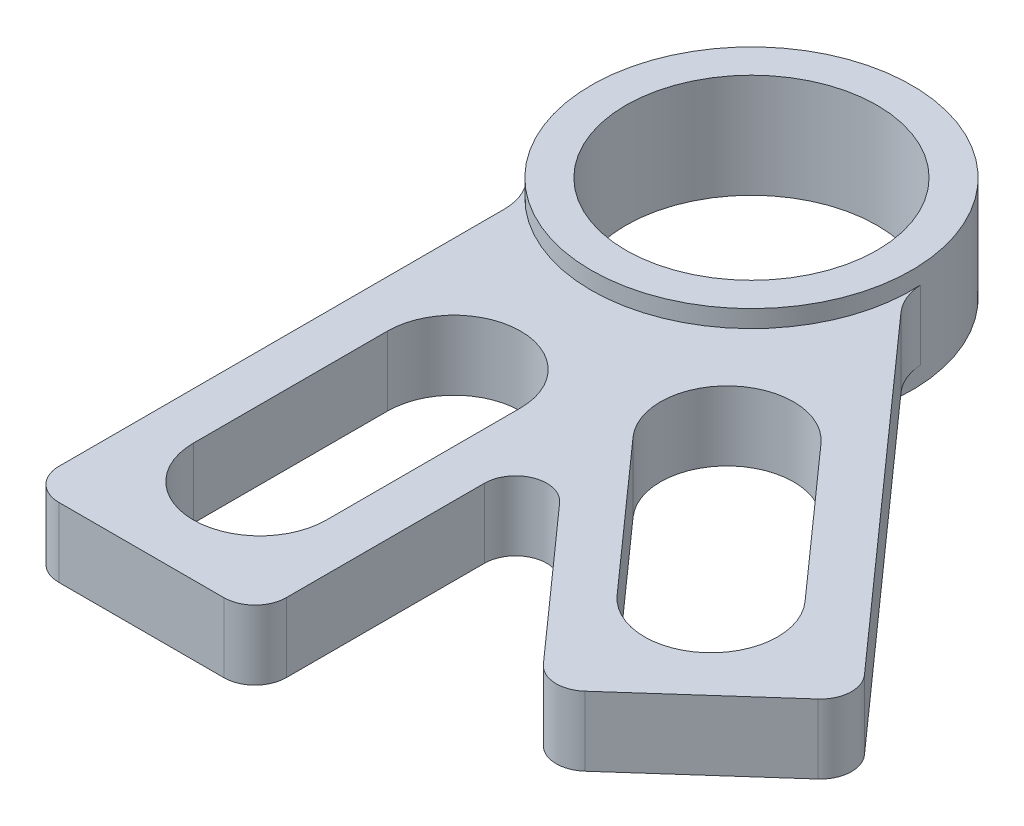
ISO-10303-21;
HEADER;
FILE_DESCRIPTION(('STEP AP214'),'2;1');
FILE_NAME('part.step','',(''),(''),'','','');
FILE_SCHEMA(('AUTOMOTIVE_DESIGN { 1 0 10303 214 1 1 1 1 }'));
ENDSEC;
DATA;
#1=APPLICATION_CONTEXT('core data for automotive mechanical design processes');
#2=APPLICATION_PROTOCOL_DEFINITION('international standard','automotive_design',2000,#1);
#3=PRODUCT_CONTEXT('',#1,'mechanical');
#4=PRODUCT('Part','Part','',(#3));
#5=PRODUCT_RELATED_PRODUCT_CATEGORY('part','',(#4));
#6=PRODUCT_DEFINITION_FORMATION('','',#4);
#7=PRODUCT_DEFINITION_CONTEXT('part definition',#1,'design');
#8=PRODUCT_DEFINITION('design','',#6,#7);
#9=PRODUCT_DEFINITION_SHAPE('','',#8);
#10=(LENGTH_UNIT() NAMED_UNIT(*) SI_UNIT(.MILLI.,.METRE.));
#11=(NAMED_UNIT(*) PLANE_ANGLE_UNIT() SI_UNIT($,.RADIAN.));
#12=(NAMED_UNIT(*) SI_UNIT($,.STERADIAN.) SOLID_ANGLE_UNIT());
#13=UNCERTAINTY_MEASURE_WITH_UNIT(LENGTH_MEASURE(1.E-05),#10,'distance_accuracy_value','');
#14=(GEOMETRIC_REPRESENTATION_CONTEXT(3) GLOBAL_UNCERTAINTY_ASSIGNED_CONTEXT((#13)) GLOBAL_UNIT_ASSIGNED_CONTEXT((#10,
#11,#12)) REPRESENTATION_CONTEXT('',''));
#15=CARTESIAN_POINT('',(0.,0.,0.));
#16=DIRECTION('',(0.,0.,1.));
#17=DIRECTION('',(1.,0.,0.));
#18=AXIS2_PLACEMENT_3D('',#15,#16,#17);
#19=CARTESIAN_POINT('',(0.,4.7625,0.));
#20=DIRECTION('',(0.,-1.,0.));
#21=DIRECTION('',(0.,0.,-1.));
#22=AXIS2_PLACEMENT_3D('',#19,#20,#21);
#23=CYLINDRICAL_SURFACE('',#22,11.5062);
#24=CARTESIAN_POINT('',(0.,4.7625,0.));
#25=DIRECTION('',(0.,1.,0.));
#26=DIRECTION('',(0.,0.,1.));
#27=AXIS2_PLACEMENT_3D('',#24,#25,#26);
#28=CIRCLE('',#27,11.5062);
#29=CARTESIAN_POINT('',(0.,4.7625,-11.5062));
#30=VERTEX_POINT('',#29);
#31=EDGE_CURVE('E301',#30,#30,#28,.T.);
#32=CARTESIAN_POINT('',(0.,-4.7625,0.));
#33=DIRECTION('',(0.,1.,0.));
#34=DIRECTION('',(0.,0.,1.));
#35=AXIS2_PLACEMENT_3D('',#32,#33,#34);
#36=CIRCLE('',#35,11.5062);
#37=CARTESIAN_POINT('',(0.,-4.7625,-11.5062));
#38=VERTEX_POINT('',#37);
#39=EDGE_CURVE('E296',#38,#38,#36,.T.);
#40=CARTESIAN_POINT('',(0.,4.7625,-11.5062));
#41=CARTESIAN_POINT('',(0.,4.66328125,-11.5062));
#42=CARTESIAN_POINT('',(0.,4.5640625,-11.5062));
#43=CARTESIAN_POINT('',(0.,4.365625,-11.5062));
#44=CARTESIAN_POINT('',(0.,4.26640625,-11.5062));
#45=CARTESIAN_POINT('',(0.,4.06796875,-11.5062));
#46=CARTESIAN_POINT('',(0.,3.96875,-11.5062));
#47=CARTESIAN_POINT('',(0.,3.7703125,-11.5062));
#48=CARTESIAN_POINT('',(0.,3.67109375,-11.5062));
#49=CARTESIAN_POINT('',(0.,3.47265625,-11.5062));
#50=CARTESIAN_POINT('',(0.,3.3734375,-11.5062));
#51=CARTESIAN_POINT('',(0.,3.175,-11.5062));
#52=CARTESIAN_POINT('',(0.,3.07578125,-11.5062));
#53=CARTESIAN_POINT('',(0.,2.87734375,-11.5062));
#54=CARTESIAN_POINT('',(0.,2.778125,-11.5062));
#55=CARTESIAN_POINT('',(0.,2.5796875,-11.5062));
#56=CARTESIAN_POINT('',(0.,2.48046875,-11.5062));
#57=CARTESIAN_POINT('',(0.,2.28203125,-11.5062));
#58=CARTESIAN_POINT('',(0.,2.1828125,-11.5062));
#59=CARTESIAN_POINT('',(0.,1.984375,-11.5062));
#60=CARTESIAN_POINT('',(0.,1.88515625,-11.5062));
#61=CARTESIAN_POINT('',(0.,1.68671875,-11.5062));
#62=CARTESIAN_POINT('',(0.,1.5875,-11.5062));
#63=CARTESIAN_POINT('',(0.,1.3890625,-11.5062));
#64=CARTESIAN_POINT('',(0.,1.28984375,-11.5062));
#65=CARTESIAN_POINT('',(0.,1.09140625,-11.5062));
#66=CARTESIAN_POINT('',(0.,0.992187499999999,-11.5062));
#67=CARTESIAN_POINT('',(0.,0.79375,-11.5062));
#68=CARTESIAN_POINT('',(0.,0.69453125,-11.5062));
#69=CARTESIAN_POINT('',(0.,0.49609375,-11.5062));
#70=CARTESIAN_POINT('',(0.,0.396875,-11.5062));
#71=CARTESIAN_POINT('',(0.,0.1984375,-11.5062));
#72=CARTESIAN_POINT('',(0.,0.0992187500000001,-11.5062));
#73=CARTESIAN_POINT('',(0.,-0.0992187500000001,-11.5062));
#74=CARTESIAN_POINT('',(0.,-0.1984375,-11.5062));
#75=CARTESIAN_POINT('',(0.,-0.396875,-11.5062));
#76=CARTESIAN_POINT('',(0.,-0.49609375,-11.5062));
#77=CARTESIAN_POINT('',(0.,-0.69453125,-11.5062));
#78=CARTESIAN_POINT('',(0.,-0.793750000000001,-11.5062));
#79=CARTESIAN_POINT('',(0.,-0.992187500000001,-11.5062));
#80=CARTESIAN_POINT('',(0.,-1.09140625,-11.5062));
#81=CARTESIAN_POINT('',(0.,-1.28984375,-11.5062));
#82=CARTESIAN_POINT('',(0.,-1.3890625,-11.5062));
#83=CARTESIAN_POINT('',(0.,-1.5875,-11.5062));
#84=CARTESIAN_POINT('',(0.,-1.68671875,-11.5062));
#85=CARTESIAN_POINT('',(0.,-1.88515625,-11.5062));
#86=CARTESIAN_POINT('',(0.,-1.984375,-11.5062));
#87=CARTESIAN_POINT('',(0.,-2.1828125,-11.5062));
#88=CARTESIAN_POINT('',(0.,-2.28203125,-11.5062));
#89=CARTESIAN_POINT('',(0.,-2.48046875,-11.5062));
#90=CARTESIAN_POINT('',(0.,-2.5796875,-11.5062));
#91=CARTESIAN_POINT('',(0.,-2.778125,-11.5062));
#92=CARTESIAN_POINT('',(0.,-2.87734375,-11.5062));
#93=CARTESIAN_POINT('',(0.,-3.07578125,-11.5062));
#94=CARTESIAN_POINT('',(0.,-3.175,-11.5062));
#95=CARTESIAN_POINT('',(0.,-3.3734375,-11.5062));
#96=CARTESIAN_POINT('',(0.,-3.47265625,-11.5062));
#97=CARTESIAN_POINT('',(0.,-3.67109375,-11.5062));
#98=CARTESIAN_POINT('',(0.,-3.7703125,-11.5062));
#99=CARTESIAN_POINT('',(0.,-3.96875,-11.5062));
#100=CARTESIAN_POINT('',(0.,-4.06796875,-11.5062));
#101=CARTESIAN_POINT('',(0.,-4.26640625,-11.5062));
#102=CARTESIAN_POINT('',(0.,-4.365625,-11.5062));
#103=CARTESIAN_POINT('',(0.,-4.5640625,-11.5062));
#104=CARTESIAN_POINT('',(0.,-4.66328125,-11.5062));
#105=CARTESIAN_POINT('',(0.,-4.7625,-11.5062));
#106=B_SPLINE_CURVE_WITH_KNOTS('',3,(#40,#41,#42,#43,#44,#45,#46,#47,#48,#49,#50,#51,#52,#53,
#54,#55,#56,#57,#58,#59,#60,#61,#62,#63,#64,#65,#66,#67,#68,#69,#70,#71,#72,#73,#74,#75,#76,#77,
#78,#79,#80,#81,#82,#83,#84,#85,#86,#87,#88,#89,#90,#91,#92,#93,#94,#95,#96,#97,#98,#99,#100,
#101,#102,#103,#104,#105),.UNSPECIFIED.,.F.,.F.,(4,2,2,2,2,2,2,2,2,2,2,2,2,2,2,2,2,2,2,2,2,2,2,
2,2,2,2,2,2,2,2,2,4),(0.,0.29765625,0.5953125,0.892968750000001,1.190625,1.48828125,1.7859375,
2.08359375,2.38125,2.67890625,2.9765625,3.27421875,3.571875,3.86953125,4.1671875,4.46484375,
4.7625,5.06015625,5.3578125,5.65546875,5.953125,6.25078125,6.5484375,6.84609375,7.14375,
7.44140625,7.7390625,8.03671875,8.334375,8.63203125,8.9296875,9.22734375,9.525),.UNSPECIFIED.);
#107=EDGE_CURVE('BSEAM43',#30,#38,#106,.T.);
#108=ORIENTED_EDGE('',*,*,#31,.T.);
#109=ORIENTED_EDGE('',*,*,#39,.F.);
#110=ORIENTED_EDGE('',*,*,#107,.T.);
#111=ORIENTED_EDGE('',*,*,#107,.F.);
#112=EDGE_LOOP('',(#108,#110,#109,#111));
#113=FACE_BOUND('',#112,.T.);
#114=ADVANCED_FACE('F43',(#113),#23,.F.);
#115=CARTESIAN_POINT('',(0.,4.7625,0.));
#116=DIRECTION('',(0.,-1.,0.));
#117=DIRECTION('',(0.,0.,-1.));
#118=AXIS2_PLACEMENT_3D('',#115,#116,#117);
#119=CYLINDRICAL_SURFACE('',#118,14.6812);
#120=DIRECTION('',(0.,-1.,0.));
#121=VECTOR('',#120,1.);
#122=CARTESIAN_POINT('',(14.6568049635446,4.7625,-0.845991548784944));
#123=LINE('',#122,#121);
#124=CARTESIAN_POINT('',(14.6568049635446,3.175,-0.845991548784944));
#125=VERTEX_POINT('',#124);
#126=CARTESIAN_POINT('',(14.6568049635446,-3.175,-0.845991548784944));
#127=VERTEX_POINT('',#126);
#128=EDGE_CURVE('E315',#125,#127,#123,.T.);
#129=ORIENTED_EDGE('',*,*,#128,.T.);
#130=CARTESIAN_POINT('',(0.,-3.175,0.));
#131=DIRECTION('',(0.,1.,0.));
#132=DIRECTION('',(0.,0.,1.));
#133=AXIS2_PLACEMENT_3D('',#130,#131,#132);
#134=CIRCLE('',#133,14.6812);
#135=CARTESIAN_POINT('',(-11.5109665809769,-3.175,9.11236971438461));
#136=VERTEX_POINT('',#135);
#137=EDGE_CURVE('E272',#136,#127,#134,.T.);
#138=ORIENTED_EDGE('',*,*,#137,.F.);
#139=DIRECTION('',(0.,-1.,0.));
#140=VECTOR('',#139,1.);
#141=CARTESIAN_POINT('',(-11.5109665809769,4.7625,9.11236971438461));
#142=LINE('',#141,#140);
#143=CARTESIAN_POINT('',(-11.5109665809769,3.175,9.11236971438461));
#144=VERTEX_POINT('',#143);
#145=EDGE_CURVE('E308',#136,#144,#142,.F.);
#146=ORIENTED_EDGE('',*,*,#145,.T.);
#147=CARTESIAN_POINT('',(0.,3.175,0.));
#148=DIRECTION('',(0.,1.,0.));
#149=DIRECTION('',(0.,0.,1.));
#150=AXIS2_PLACEMENT_3D('',#147,#148,#149);
#151=CIRCLE('',#150,14.6812);
#152=EDGE_CURVE('E234',#144,#125,#151,.T.);
#153=ORIENTED_EDGE('',*,*,#152,.T.);
#154=EDGE_LOOP('',(#129,#138,#146,#153));
#155=FACE_BOUND('',#154,.T.);
#156=CARTESIAN_POINT('',(0.,4.7625,0.));
#157=DIRECTION('',(0.,1.,0.));
#158=DIRECTION('',(0.,0.,1.));
#159=AXIS2_PLACEMENT_3D('',#156,#157,#158);
#160=CIRCLE('',#159,14.6812);
#161=CARTESIAN_POINT('',(0.,4.7625,14.6812));
#162=VERTEX_POINT('',#161);
#163=EDGE_CURVE('E304',#162,#162,#160,.T.);
#164=ORIENTED_EDGE('',*,*,#163,.F.);
#165=EDGE_LOOP('',(#164));
#166=FACE_BOUND('',#165,.T.);
#167=CARTESIAN_POINT('',(0.,-4.7625,0.));
#168=DIRECTION('',(0.,1.,0.));
#169=DIRECTION('',(0.,0.,1.));
#170=AXIS2_PLACEMENT_3D('',#167,#168,#169);
#171=CIRCLE('',#170,14.6812);
#172=CARTESIAN_POINT('',(0.,-4.7625,14.6812));
#173=VERTEX_POINT('',#172);
#174=EDGE_CURVE('E305',#173,#173,#171,.T.);
#175=ORIENTED_EDGE('',*,*,#174,.T.);
#176=EDGE_LOOP('',(#175));
#177=FACE_BOUND('',#176,.T.);
#178=ADVANCED_FACE('F411',(#155,#166,#177),#119,.T.);
#179=CARTESIAN_POINT('',(0.,4.7625,0.));
#180=DIRECTION('',(0.,1.,0.));
#181=DIRECTION('',(0.,0.,1.));
#182=AXIS2_PLACEMENT_3D('',#179,#180,#181);
#183=PLANE('',#182);
#184=ORIENTED_EDGE('',*,*,#31,.F.);
#185=EDGE_LOOP('',(#184));
#186=FACE_BOUND('',#185,.T.);
#187=ORIENTED_EDGE('',*,*,#163,.T.);
#188=EDGE_LOOP('',(#187));
#189=FACE_BOUND('',#188,.T.);
#190=ADVANCED_FACE('F447',(#186,#189),#183,.T.);
#191=CARTESIAN_POINT('',(0.,-4.7625,0.));
#192=DIRECTION('',(0.,1.,0.));
#193=DIRECTION('',(0.,0.,1.));
#194=AXIS2_PLACEMENT_3D('',#191,#192,#193);
#195=PLANE('',#194);
#196=ORIENTED_EDGE('',*,*,#39,.T.);
#197=EDGE_LOOP('',(#196));
#198=FACE_BOUND('',#197,.T.);
#199=ORIENTED_EDGE('',*,*,#174,.F.);
#200=EDGE_LOOP('',(#199));
#201=FACE_BOUND('',#200,.T.);
#202=ADVANCED_FACE('F621',(#198,#201),#195,.F.);
#203=CARTESIAN_POINT('',(-10.414,3.175,0.));
#204=DIRECTION('',(-1.,0.,0.));
#205=DIRECTION('',(0.,0.,1.));
#206=AXIS2_PLACEMENT_3D('',#203,#204,#205);
#207=PLANE('',#206);
#208=DIRECTION('',(0.,0.,-1.));
#209=VECTOR('',#208,1.);
#210=CARTESIAN_POINT('',(-10.414,-3.175,0.));
#211=LINE('',#210,#209);
#212=CARTESIAN_POINT('',(-10.414,-3.175,53.0225));
#213=VERTEX_POINT('',#212);
#214=CARTESIAN_POINT('',(-10.414,-3.175,12.265438819708));
#215=VERTEX_POINT('',#214);
#216=EDGE_CURVE('E274',#213,#215,#211,.T.);
#217=ORIENTED_EDGE('',*,*,#216,.F.);
#218=DIRECTION('',(0.,-1.,0.));
#219=VECTOR('',#218,1.);
#220=CARTESIAN_POINT('',(-10.414,3.175,53.0225));
#221=LINE('',#220,#219);
#222=CARTESIAN_POINT('',(-10.414,3.175,53.0225));
#223=VERTEX_POINT('',#222);
#224=EDGE_CURVE('E374',#213,#223,#221,.F.);
#225=ORIENTED_EDGE('',*,*,#224,.T.);
#226=DIRECTION('',(0.,0.,-1.));
#227=VECTOR('',#226,1.);
#228=CARTESIAN_POINT('',(-10.414,3.175,0.));
#229=LINE('',#228,#227);
#230=CARTESIAN_POINT('',(-10.414,3.175,12.265438819708));
#231=VERTEX_POINT('',#230);
#232=EDGE_CURVE('E236',#223,#231,#229,.T.);
#233=ORIENTED_EDGE('',*,*,#232,.T.);
#234=DIRECTION('',(0.,-1.,0.));
#235=VECTOR('',#234,1.);
#236=CARTESIAN_POINT('',(-10.414,3.175,12.265438819708));
#237=LINE('',#236,#235);
#238=EDGE_CURVE('E321',#231,#215,#237,.T.);
#239=ORIENTED_EDGE('',*,*,#238,.T.);
#240=EDGE_LOOP('',(#217,#225,#233,#239));
#241=FACE_BOUND('',#240,.T.);
#242=ADVANCED_FACE('F613',(#241),#207,.T.);
#243=CARTESIAN_POINT('',(0.,3.175,55.88));
#244=DIRECTION('',(0.,0.,-1.));
#245=DIRECTION('',(-1.,0.,0.));
#246=AXIS2_PLACEMENT_3D('',#243,#244,#245);
#247=PLANE('',#246);
#248=DIRECTION('',(1.,0.,0.));
#249=VECTOR('',#248,1.);
#250=CARTESIAN_POINT('',(0.,-3.175,55.88));
#251=LINE('',#250,#249);
#252=CARTESIAN_POINT('',(-7.55649999999999,-3.175,55.88));
#253=VERTEX_POINT('',#252);
#254=CARTESIAN_POINT('',(7.55650000000001,-3.175,55.88));
#255=VERTEX_POINT('',#254);
#256=EDGE_CURVE('E276',#253,#255,#251,.T.);
#257=ORIENTED_EDGE('',*,*,#256,.T.);
#258=DIRECTION('',(0.,-1.,0.));
#259=VECTOR('',#258,1.);
#260=CARTESIAN_POINT('',(7.55650000000001,3.175,55.88));
#261=LINE('',#260,#259);
#262=CARTESIAN_POINT('',(7.55650000000001,3.175,55.88));
#263=VERTEX_POINT('',#262);
#264=EDGE_CURVE('E372',#255,#263,#261,.F.);
#265=ORIENTED_EDGE('',*,*,#264,.T.);
#266=DIRECTION('',(1.,0.,0.));
#267=VECTOR('',#266,1.);
#268=CARTESIAN_POINT('',(0.,3.175,55.88));
#269=LINE('',#268,#267);
#270=CARTESIAN_POINT('',(-7.55649999999999,3.175,55.88));
#271=VERTEX_POINT('',#270);
#272=EDGE_CURVE('E238',#271,#263,#269,.T.);
#273=ORIENTED_EDGE('',*,*,#272,.F.);
#274=DIRECTION('',(0.,-1.,0.));
#275=VECTOR('',#274,1.);
#276=CARTESIAN_POINT('',(-7.55649999999999,-3.175,55.88));
#277=LINE('',#276,#275);
#278=EDGE_CURVE('E369',#271,#253,#277,.T.);
#279=ORIENTED_EDGE('',*,*,#278,.T.);
#280=EDGE_LOOP('',(#257,#265,#273,#279));
#281=FACE_BOUND('',#280,.T.);
#282=ADVANCED_FACE('F428',(#281),#247,.F.);
#283=CARTESIAN_POINT('',(10.414,3.175,0.));
#284=DIRECTION('',(-1.,0.,0.));
#285=DIRECTION('',(0.,0.,1.));
#286=AXIS2_PLACEMENT_3D('',#283,#284,#285);
#287=PLANE('',#286);
#288=DIRECTION('',(0.,0.,-1.));
#289=VECTOR('',#288,1.);
#290=CARTESIAN_POINT('',(10.414,-3.175,0.));
#291=LINE('',#290,#289);
#292=CARTESIAN_POINT('',(10.414,-3.175,53.0225));
#293=VERTEX_POINT('',#292);
#294=CARTESIAN_POINT('',(10.414,-3.175,34.8737679699906));
#295=VERTEX_POINT('',#294);
#296=EDGE_CURVE('E279',#293,#295,#291,.T.);
#297=ORIENTED_EDGE('',*,*,#296,.T.);
#298=DIRECTION('',(0.,-1.,0.));
#299=VECTOR('',#298,1.);
#300=CARTESIAN_POINT('',(10.414,3.175,34.8737679699906));
#301=LINE('',#300,#299);
#302=CARTESIAN_POINT('',(10.414,3.175,34.8737679699906));
#303=VERTEX_POINT('',#302);
#304=EDGE_CURVE('E367',#295,#303,#301,.F.);
#305=ORIENTED_EDGE('',*,*,#304,.T.);
#306=DIRECTION('',(0.,0.,-1.));
#307=VECTOR('',#306,1.);
#308=CARTESIAN_POINT('',(10.414,3.175,0.));
#309=LINE('',#308,#307);
#310=CARTESIAN_POINT('',(10.414,3.175,53.0225));
#311=VERTEX_POINT('',#310);
#312=EDGE_CURVE('E241',#311,#303,#309,.T.);
#313=ORIENTED_EDGE('',*,*,#312,.F.);
#314=DIRECTION('',(0.,-1.,0.));
#315=VECTOR('',#314,1.);
#316=CARTESIAN_POINT('',(10.414,3.175,53.0225));
#317=LINE('',#316,#315);
#318=EDGE_CURVE('E364',#311,#293,#317,.T.);
#319=ORIENTED_EDGE('',*,*,#318,.T.);
#320=EDGE_LOOP('',(#297,#305,#313,#319));
#321=FACE_BOUND('',#320,.T.);
#322=ADVANCED_FACE('F383',(#321),#287,.F.);
#323=CARTESIAN_POINT('',(-7.77918031554812,3.175,6.92356480566002));
#324=DIRECTION('',(-0.746992540383008,0.,0.664832418442528));
#325=DIRECTION('',(0.664832418442528,0.,0.746992540383008));
#326=AXIS2_PLACEMENT_3D('',#323,#324,#325);
#327=PLANE('',#326);
#328=DIRECTION('',(-0.664832418442528,0.,-0.746992540383008));
#329=VECTOR('',#328,1.);
#330=CARTESIAN_POINT('',(-7.77918031554812,-3.175,6.92356480566002));
#331=LINE('',#330,#329);
#332=CARTESIAN_POINT('',(27.471896591321,-3.175,46.5309767781182));
#333=VERTEX_POINT('',#332);
#334=CARTESIAN_POINT('',(15.4060311841444,-3.175,32.974009334291));
#335=VERTEX_POINT('',#334);
#336=EDGE_CURVE('E282',#333,#335,#331,.T.);
#337=ORIENTED_EDGE('',*,*,#336,.F.);
#338=DIRECTION('',(0.,-1.,0.));
#339=VECTOR('',#338,1.);
#340=CARTESIAN_POINT('',(27.471896591321,3.175,46.5309767781182));
#341=LINE('',#340,#339);
#342=CARTESIAN_POINT('',(27.471896591321,3.175,46.5309767781182));
#343=VERTEX_POINT('',#342);
#344=EDGE_CURVE('E63',#333,#343,#341,.F.);
#345=ORIENTED_EDGE('',*,*,#344,.T.);
#346=DIRECTION('',(-0.664832418442528,0.,-0.746992540383008));
#347=VECTOR('',#346,1.);
#348=CARTESIAN_POINT('',(-7.77918031554812,3.175,6.92356480566002));
#349=LINE('',#348,#347);
#350=CARTESIAN_POINT('',(15.4060311841444,3.175,32.974009334291));
#351=VERTEX_POINT('',#350);
#352=EDGE_CURVE('E243',#343,#351,#349,.T.);
#353=ORIENTED_EDGE('',*,*,#352,.T.);
#354=DIRECTION('',(0.,-1.,0.));
#355=VECTOR('',#354,1.);
#356=CARTESIAN_POINT('',(15.4060311841444,3.175,32.974009334291));
#357=LINE('',#356,#355);
#358=EDGE_CURVE('E360',#351,#335,#357,.T.);
#359=ORIENTED_EDGE('',*,*,#358,.T.);
#360=EDGE_LOOP('',(#337,#345,#353,#359));
#361=FACE_BOUND('',#360,.T.);
#362=ADVANCED_FACE('F387',(#361),#327,.T.);
#363=CARTESIAN_POINT('',(37.1508355425697,3.175,41.7419431566014));
#364=DIRECTION('',(-0.66483241844255,0.,-0.746992540382988));
#365=DIRECTION('',(-0.746992540382988,0.,0.66483241844255));
#366=AXIS2_PLACEMENT_3D('',#363,#364,#365);
#367=PLANE('',#366);
#368=DIRECTION('',(0.746992540382988,0.,-0.66483241844255));
#369=VECTOR('',#368,1.);
#370=CARTESIAN_POINT('',(37.1508355425697,-3.175,41.7419431566014));
#371=LINE('',#370,#369);
#372=CARTESIAN_POINT('',(31.506186411165,-3.175,46.7657493265631));
#373=VERTEX_POINT('',#372);
#374=CARTESIAN_POINT('',(42.7954846739731,-3.175,36.7181369866409));
#375=VERTEX_POINT('',#374);
#376=EDGE_CURVE('E285',#373,#375,#371,.T.);
#377=ORIENTED_EDGE('',*,*,#376,.T.);
#378=DIRECTION('',(0.,-1.,0.));
#379=VECTOR('',#378,1.);
#380=CARTESIAN_POINT('',(42.7954846739731,3.175,36.7181369866409));
#381=LINE('',#380,#379);
#382=CARTESIAN_POINT('',(42.7954846739731,3.175,36.7181369866409));
#383=VERTEX_POINT('',#382);
#384=EDGE_CURVE('E350',#375,#383,#381,.F.);
#385=ORIENTED_EDGE('',*,*,#384,.T.);
#386=DIRECTION('',(0.746992540382988,0.,-0.66483241844255));
#387=VECTOR('',#386,1.);
#388=CARTESIAN_POINT('',(37.1508355425697,3.175,41.7419431566014));
#389=LINE('',#388,#387);
#390=CARTESIAN_POINT('',(31.506186411165,3.175,46.7657493265631));
#391=VERTEX_POINT('',#390);
#392=EDGE_CURVE('E245',#391,#383,#389,.T.);
#393=ORIENTED_EDGE('',*,*,#392,.F.);
#394=DIRECTION('',(0.,-1.,0.));
#395=VECTOR('',#394,1.);
#396=CARTESIAN_POINT('',(31.506186411165,-3.175,46.7657493265631));
#397=LINE('',#396,#395);
#398=EDGE_CURVE('E347',#391,#373,#397,.T.);
#399=ORIENTED_EDGE('',*,*,#398,.T.);
#400=EDGE_LOOP('',(#377,#385,#393,#399));
#401=FACE_BOUND('',#400,.T.);
#402=ADVANCED_FACE('F395',(#401),#367,.F.);
#403=CARTESIAN_POINT('',(0.,3.175,27.2415));
#404=DIRECTION('',(0.,-1.,0.));
#405=DIRECTION('',(0.,0.,-1.));
#406=AXIS2_PLACEMENT_3D('',#403,#404,#405);
#407=CYLINDRICAL_SURFACE('',#406,6.096);
#408=CARTESIAN_POINT('',(0.,-3.175,27.2415));
#409=DIRECTION('',(0.,1.,0.));
#410=DIRECTION('',(0.,0.,1.));
#411=AXIS2_PLACEMENT_3D('',#408,#409,#410);
#412=CIRCLE('',#411,6.096);
#413=CARTESIAN_POINT('',(6.096,-3.175,27.2415));
#414=VERTEX_POINT('',#413);
#415=CARTESIAN_POINT('',(-6.09599999999999,-3.175,27.2415));
#416=VERTEX_POINT('',#415);
#417=EDGE_CURVE('E260',#414,#416,#412,.T.);
#418=ORIENTED_EDGE('',*,*,#417,.F.);
#419=DIRECTION('',(0.,-1.,0.));
#420=VECTOR('',#419,1.);
#421=CARTESIAN_POINT('',(6.096,3.175,27.2415));
#422=LINE('',#421,#420);
#423=CARTESIAN_POINT('',(6.096,3.175,27.2415));
#424=VERTEX_POINT('',#423);
#425=EDGE_CURVE('E294',#424,#414,#422,.T.);
#426=ORIENTED_EDGE('',*,*,#425,.F.);
#427=CARTESIAN_POINT('',(0.,3.175,27.2415));
#428=DIRECTION('',(0.,1.,0.));
#429=DIRECTION('',(0.,0.,1.));
#430=AXIS2_PLACEMENT_3D('',#427,#428,#429);
#431=CIRCLE('',#430,6.096);
#432=CARTESIAN_POINT('',(-6.09599999999999,3.175,27.2415));
#433=VERTEX_POINT('',#432);
#434=EDGE_CURVE('E223',#424,#433,#431,.T.);
#435=ORIENTED_EDGE('',*,*,#434,.T.);
#436=DIRECTION('',(0.,-1.,0.));
#437=VECTOR('',#436,1.);
#438=CARTESIAN_POINT('',(-6.09599999999999,3.175,27.2415));
#439=LINE('',#438,#437);
#440=EDGE_CURVE('E202',#433,#416,#439,.T.);
#441=ORIENTED_EDGE('',*,*,#440,.T.);
#442=EDGE_LOOP('',(#418,#426,#435,#441));
#443=FACE_BOUND('',#442,.T.);
#444=ADVANCED_FACE('F575',(#443),#407,.F.);
#445=CARTESIAN_POINT('',(6.096,3.175,0.));
#446=DIRECTION('',(-1.,0.,0.));
#447=DIRECTION('',(0.,0.,1.));
#448=AXIS2_PLACEMENT_3D('',#445,#446,#447);
#449=PLANE('',#448);
#450=DIRECTION('',(0.,0.,-1.));
#451=VECTOR('',#450,1.);
#452=CARTESIAN_POINT('',(6.096,-3.175,0.));
#453=LINE('',#452,#451);
#454=CARTESIAN_POINT('',(6.096,-3.175,45.0215));
#455=VERTEX_POINT('',#454);
#456=EDGE_CURVE('E263',#455,#414,#453,.T.);
#457=ORIENTED_EDGE('',*,*,#456,.F.);
#458=DIRECTION('',(0.,-1.,0.));
#459=VECTOR('',#458,1.);
#460=CARTESIAN_POINT('',(6.096,3.175,45.0215));
#461=LINE('',#460,#459);
#462=CARTESIAN_POINT('',(6.096,3.175,45.0215));
#463=VERTEX_POINT('',#462);
#464=EDGE_CURVE('E292',#463,#455,#461,.T.);
#465=ORIENTED_EDGE('',*,*,#464,.F.);
#466=DIRECTION('',(0.,0.,-1.));
#467=VECTOR('',#466,1.);
#468=CARTESIAN_POINT('',(6.096,3.175,0.));
#469=LINE('',#468,#467);
#470=EDGE_CURVE('E226',#463,#424,#469,.T.);
#471=ORIENTED_EDGE('',*,*,#470,.T.);
#472=ORIENTED_EDGE('',*,*,#425,.T.);
#473=EDGE_LOOP('',(#457,#465,#471,#472));
#474=FACE_BOUND('',#473,.T.);
#475=ADVANCED_FACE('F566',(#474),#449,.T.);
#476=CARTESIAN_POINT('',(0.,3.175,45.0215));
#477=DIRECTION('',(0.,-1.,0.));
#478=DIRECTION('',(0.,0.,-1.));
#479=AXIS2_PLACEMENT_3D('',#476,#477,#478);
#480=CYLINDRICAL_SURFACE('',#479,6.096);
#481=CARTESIAN_POINT('',(0.,-3.175,45.0215));
#482=DIRECTION('',(0.,1.,0.));
#483=DIRECTION('',(0.,0.,1.));
#484=AXIS2_PLACEMENT_3D('',#481,#482,#483);
#485=CIRCLE('',#484,6.096);
#486=CARTESIAN_POINT('',(-6.09599999999999,-3.175,45.0215));
#487=VERTEX_POINT('',#486);
#488=EDGE_CURVE('E266',#487,#455,#485,.T.);
#489=ORIENTED_EDGE('',*,*,#488,.F.);
#490=DIRECTION('',(0.,-1.,0.));
#491=VECTOR('',#490,1.);
#492=CARTESIAN_POINT('',(-6.09599999999999,3.175,45.0215));
#493=LINE('',#492,#491);
#494=CARTESIAN_POINT('',(-6.09599999999999,3.175,45.0215));
#495=VERTEX_POINT('',#494);
#496=EDGE_CURVE('E290',#495,#487,#493,.T.);
#497=ORIENTED_EDGE('',*,*,#496,.F.);
#498=CARTESIAN_POINT('',(0.,3.175,45.0215));
#499=DIRECTION('',(0.,1.,0.));
#500=DIRECTION('',(0.,0.,1.));
#501=AXIS2_PLACEMENT_3D('',#498,#499,#500);
#502=CIRCLE('',#501,6.096);
#503=EDGE_CURVE('E229',#495,#463,#502,.T.);
#504=ORIENTED_EDGE('',*,*,#503,.T.);
#505=ORIENTED_EDGE('',*,*,#464,.T.);
#506=EDGE_LOOP('',(#489,#497,#504,#505));
#507=FACE_BOUND('',#506,.T.);
#508=ADVANCED_FACE('F558',(#507),#480,.F.);
#509=CARTESIAN_POINT('',(18.1110323270028,3.175,20.3491972888431));
#510=DIRECTION('',(0.,-1.,0.));
#511=DIRECTION('',(0.,0.,-1.));
#512=AXIS2_PLACEMENT_3D('',#509,#510,#511);
#513=CYLINDRICAL_SURFACE('',#512,6.09600000000001);
#514=CARTESIAN_POINT('',(18.1110323270028,-3.175,20.3491972888431));
#515=DIRECTION('',(0.,1.,0.));
#516=DIRECTION('',(0.,0.,1.));
#517=AXIS2_PLACEMENT_3D('',#514,#515,#516);
#518=CIRCLE('',#517,6.09600000000001);
#519=CARTESIAN_POINT('',(22.6646988531775,-3.175,16.2963788660173));
#520=VERTEX_POINT('',#519);
#521=CARTESIAN_POINT('',(13.5573658008281,-3.175,24.4020157116689));
#522=VERTEX_POINT('',#521);
#523=EDGE_CURVE('E197',#520,#522,#518,.T.);
#524=ORIENTED_EDGE('',*,*,#523,.F.);
#525=DIRECTION('',(0.,-1.,0.));
#526=VECTOR('',#525,1.);
#527=CARTESIAN_POINT('',(22.6646988531775,3.175,16.2963788660173));
#528=LINE('',#527,#526);
#529=CARTESIAN_POINT('',(22.6646988531775,3.175,16.2963788660173));
#530=VERTEX_POINT('',#529);
#531=EDGE_CURVE('E192',#530,#520,#528,.T.);
#532=ORIENTED_EDGE('',*,*,#531,.F.);
#533=CARTESIAN_POINT('',(18.1110323270028,3.175,20.3491972888431));
#534=DIRECTION('',(0.,1.,0.));
#535=DIRECTION('',(0.,0.,1.));
#536=AXIS2_PLACEMENT_3D('',#533,#534,#535);
#537=CIRCLE('',#536,6.09600000000001);
#538=CARTESIAN_POINT('',(13.5573658008281,3.175,24.4020157116689));
#539=VERTEX_POINT('',#538);
#540=EDGE_CURVE('E195',#530,#539,#537,.T.);
#541=ORIENTED_EDGE('',*,*,#540,.T.);
#542=DIRECTION('',(0.,-1.,0.));
#543=VECTOR('',#542,1.);
#544=CARTESIAN_POINT('',(13.5573658008281,3.175,24.4020157116689));
#545=LINE('',#544,#543);
#546=EDGE_CURVE('E250',#539,#522,#545,.T.);
#547=ORIENTED_EDGE('',*,*,#546,.T.);
#548=EDGE_LOOP('',(#524,#532,#541,#547));
#549=FACE_BOUND('',#548,.T.);
#550=ADVANCED_FACE('F194',(#549),#513,.F.);
#551=CARTESIAN_POINT('',(4.55366652617486,3.175,-4.05281842282592));
#552=DIRECTION('',(-0.74699254038299,0.,0.664832418442548));
#553=DIRECTION('',(0.664832418442548,0.,0.74699254038299));
#554=AXIS2_PLACEMENT_3D('',#551,#552,#553);
#555=PLANE('',#554);
#556=DIRECTION('',(-0.664832418442548,0.,-0.74699254038299));
#557=VECTOR('',#556,1.);
#558=CARTESIAN_POINT('',(4.55366652617486,-3.175,-4.05281842282592));
#559=LINE('',#558,#557);
#560=CARTESIAN_POINT('',(34.4854192530861,-3.175,29.5779062340269));
#561=VERTEX_POINT('',#560);
#562=EDGE_CURVE('E252',#561,#520,#559,.T.);
#563=ORIENTED_EDGE('',*,*,#562,.F.);
#564=DIRECTION('',(0.,-1.,0.));
#565=VECTOR('',#564,1.);
#566=CARTESIAN_POINT('',(34.4854192530861,3.175,29.5779062340269));
#567=LINE('',#566,#565);
#568=CARTESIAN_POINT('',(34.4854192530861,3.175,29.5779062340269));
#569=VERTEX_POINT('',#568);
#570=EDGE_CURVE('E203',#569,#561,#567,.T.);
#571=ORIENTED_EDGE('',*,*,#570,.F.);
#572=DIRECTION('',(-0.664832418442548,0.,-0.74699254038299));
#573=VECTOR('',#572,1.);
#574=CARTESIAN_POINT('',(4.55366652617486,3.175,-4.05281842282592));
#575=LINE('',#574,#573);
#576=EDGE_CURVE('E210',#569,#530,#575,.T.);
#577=ORIENTED_EDGE('',*,*,#576,.T.);
#578=ORIENTED_EDGE('',*,*,#531,.T.);
#579=EDGE_LOOP('',(#563,#571,#577,#578));
#580=FACE_BOUND('',#579,.T.);
#581=ADVANCED_FACE('F217',(#580),#555,.T.);
#582=CARTESIAN_POINT('',(29.9317527269114,3.175,33.6307246568526));
#583=DIRECTION('',(0.,-1.,0.));
#584=DIRECTION('',(0.,0.,-1.));
#585=AXIS2_PLACEMENT_3D('',#582,#583,#584);
#586=CYLINDRICAL_SURFACE('',#585,6.096);
#587=CARTESIAN_POINT('',(29.9317527269114,-3.175,33.6307246568526));
#588=DIRECTION('',(0.,1.,0.));
#589=DIRECTION('',(0.,0.,1.));
#590=AXIS2_PLACEMENT_3D('',#587,#588,#589);
#591=CIRCLE('',#590,6.096);
#592=CARTESIAN_POINT('',(25.3780862007367,-3.175,37.6835430796784));
#593=VERTEX_POINT('',#592);
#594=EDGE_CURVE('E254',#593,#561,#591,.T.);
#595=ORIENTED_EDGE('',*,*,#594,.F.);
#596=DIRECTION('',(0.,-1.,0.));
#597=VECTOR('',#596,1.);
#598=CARTESIAN_POINT('',(25.3780862007367,3.175,37.6835430796784));
#599=LINE('',#598,#597);
#600=CARTESIAN_POINT('',(25.3780862007367,3.175,37.6835430796784));
#601=VERTEX_POINT('',#600);
#602=EDGE_CURVE('E298',#601,#593,#599,.T.);
#603=ORIENTED_EDGE('',*,*,#602,.F.);
#604=CARTESIAN_POINT('',(29.9317527269114,3.175,33.6307246568526));
#605=DIRECTION('',(0.,1.,0.));
#606=DIRECTION('',(0.,0.,1.));
#607=AXIS2_PLACEMENT_3D('',#604,#605,#606);
#608=CIRCLE('',#607,6.096);
#609=EDGE_CURVE('E218',#601,#569,#608,.T.);
#610=ORIENTED_EDGE('',*,*,#609,.T.);
#611=ORIENTED_EDGE('',*,*,#570,.T.);
#612=EDGE_LOOP('',(#595,#603,#610,#611));
#613=FACE_BOUND('',#612,.T.);
#614=ADVANCED_FACE('F534',(#613),#586,.F.);
#615=CARTESIAN_POINT('',(-6.09599999999999,3.175,0.));
#616=DIRECTION('',(-1.,0.,0.));
#617=DIRECTION('',(0.,0.,1.));
#618=AXIS2_PLACEMENT_3D('',#615,#616,#617);
#619=PLANE('',#618);
#620=DIRECTION('',(0.,0.,-1.));
#621=VECTOR('',#620,1.);
#622=CARTESIAN_POINT('',(-6.09599999999999,-3.175,0.));
#623=LINE('',#622,#621);
#624=EDGE_CURVE('E269',#487,#416,#623,.T.);
#625=ORIENTED_EDGE('',*,*,#624,.T.);
#626=ORIENTED_EDGE('',*,*,#440,.F.);
#627=DIRECTION('',(0.,0.,-1.));
#628=VECTOR('',#627,1.);
#629=CARTESIAN_POINT('',(-6.09599999999999,3.175,0.));
#630=LINE('',#629,#628);
#631=EDGE_CURVE('E232',#495,#433,#630,.T.);
#632=ORIENTED_EDGE('',*,*,#631,.F.);
#633=ORIENTED_EDGE('',*,*,#496,.T.);
#634=EDGE_LOOP('',(#625,#626,#632,#633));
#635=FACE_BOUND('',#634,.T.);
#636=ADVANCED_FACE('F525',(#635),#619,.F.);
#637=CARTESIAN_POINT('',(-4.55366652617456,3.175,4.05281842282565));
#638=DIRECTION('',(-0.746992540382989,0.,0.664832418442549));
#639=DIRECTION('',(0.664832418442549,0.,0.746992540382989));
#640=AXIS2_PLACEMENT_3D('',#637,#638,#639);
#641=PLANE('',#640);
#642=DIRECTION('',(-0.664832418442549,0.,-0.746992540382989));
#643=VECTOR('',#642,1.);
#644=CARTESIAN_POINT('',(-4.55366652617456,-3.175,4.05281842282565));
#645=LINE('',#644,#643);
#646=EDGE_CURVE('E257',#593,#522,#645,.T.);
#647=ORIENTED_EDGE('',*,*,#646,.T.);
#648=ORIENTED_EDGE('',*,*,#546,.F.);
#649=DIRECTION('',(-0.664832418442549,0.,-0.746992540382989));
#650=VECTOR('',#649,1.);
#651=CARTESIAN_POINT('',(-4.55366652617456,3.175,4.05281842282565));
#652=LINE('',#651,#650);
#653=EDGE_CURVE('E213',#601,#539,#652,.T.);
#654=ORIENTED_EDGE('',*,*,#653,.F.);
#655=ORIENTED_EDGE('',*,*,#602,.T.);
#656=EDGE_LOOP('',(#647,#648,#654,#655));
#657=FACE_BOUND('',#656,.T.);
#658=ADVANCED_FACE('F517',(#657),#641,.F.);
#659=CARTESIAN_POINT('',(7.77918031554868,3.175,-6.92356480566066));
#660=DIRECTION('',(-0.746992540383001,0.,0.664832418442535));
#661=DIRECTION('',(0.664832418442535,0.,0.746992540383001));
#662=AXIS2_PLACEMENT_3D('',#659,#660,#661);
#663=PLANE('',#662);
#664=DIRECTION('',(-0.664832418442535,0.,-0.746992540383001));
#665=VECTOR('',#664,1.);
#666=CARTESIAN_POINT('',(7.77918031554868,3.175,-6.92356480566066));
#667=LINE('',#666,#665);
#668=CARTESIAN_POINT('',(43.0302572224179,3.175,32.6838471667969));
#669=VERTEX_POINT('',#668);
#670=CARTESIAN_POINT('',(15.933641669314,3.175,2.23862649718516));
#671=VERTEX_POINT('',#670);
#672=EDGE_CURVE('E248',#669,#671,#667,.T.);
#673=ORIENTED_EDGE('',*,*,#672,.F.);
#674=DIRECTION('',(0.,-1.,0.));
#675=VECTOR('',#674,1.);
#676=CARTESIAN_POINT('',(43.0302572224179,3.175,32.6838471667969));
#677=LINE('',#676,#675);
#678=CARTESIAN_POINT('',(43.0302572224179,-3.175,32.6838471667969));
#679=VERTEX_POINT('',#678);
#680=EDGE_CURVE('E336',#669,#679,#677,.T.);
#681=ORIENTED_EDGE('',*,*,#680,.T.);
#682=DIRECTION('',(-0.664832418442535,0.,-0.746992540383001));
#683=VECTOR('',#682,1.);
#684=CARTESIAN_POINT('',(7.77918031554868,-3.175,-6.92356480566066));
#685=LINE('',#684,#683);
#686=CARTESIAN_POINT('',(15.933641669314,-3.175,2.23862649718516));
#687=VERTEX_POINT('',#686);
#688=EDGE_CURVE('E215',#679,#687,#685,.T.);
#689=ORIENTED_EDGE('',*,*,#688,.T.);
#690=DIRECTION('',(0.,1.,0.));
#691=VECTOR('',#690,1.);
#692=CARTESIAN_POINT('',(15.933641669314,3.175,2.23862649718516));
#693=LINE('',#692,#691);
#694=EDGE_CURVE('E318',#687,#671,#693,.T.);
#695=ORIENTED_EDGE('',*,*,#694,.T.);
#696=EDGE_LOOP('',(#673,#681,#689,#695));
#697=FACE_BOUND('',#696,.T.);
#698=ADVANCED_FACE('F403',(#697),#663,.F.);
#699=CARTESIAN_POINT('',(0.,3.175,0.));
#700=DIRECTION('',(0.,1.,0.));
#701=DIRECTION('',(0.,0.,1.));
#702=AXIS2_PLACEMENT_3D('',#699,#700,#701);
#703=PLANE('',#702);
#704=ORIENTED_EDGE('',*,*,#540,.F.);
#705=ORIENTED_EDGE('',*,*,#576,.F.);
#706=ORIENTED_EDGE('',*,*,#609,.F.);
#707=ORIENTED_EDGE('',*,*,#653,.T.);
#708=EDGE_LOOP('',(#704,#705,#706,#707));
#709=FACE_BOUND('',#708,.T.);
#710=ORIENTED_EDGE('',*,*,#434,.F.);
#711=ORIENTED_EDGE('',*,*,#470,.F.);
#712=ORIENTED_EDGE('',*,*,#503,.F.);
#713=ORIENTED_EDGE('',*,*,#631,.T.);
#714=EDGE_LOOP('',(#710,#711,#712,#713));
#715=FACE_BOUND('',#714,.T.);
#716=ORIENTED_EDGE('',*,*,#392,.T.);
#717=CARTESIAN_POINT('',(40.8957260382735,3.175,34.5836058024965));
#718=DIRECTION('',(0.,1.,0.));
#719=DIRECTION('',(0.,0.,1.));
#720=AXIS2_PLACEMENT_3D('',#717,#718,#719);
#721=CIRCLE('',#720,2.8575);
#722=EDGE_CURVE('E358',#383,#669,#721,.T.);
#723=ORIENTED_EDGE('',*,*,#722,.T.);
#724=ORIENTED_EDGE('',*,*,#672,.T.);
#725=CARTESIAN_POINT('',(19.7283637744596,3.175,-1.13872218850292));
#726=DIRECTION('',(0.,1.,0.));
#727=DIRECTION('',(0.,0.,1.));
#728=AXIS2_PLACEMENT_3D('',#725,#726,#727);
#729=CIRCLE('',#728,5.08);
#730=EDGE_CURVE('E327',#671,#125,#729,.F.);
#731=ORIENTED_EDGE('',*,*,#730,.T.);
#732=ORIENTED_EDGE('',*,*,#152,.F.);
#733=CARTESIAN_POINT('',(-15.494,3.175,12.265438819708));
#734=DIRECTION('',(0.,1.,0.));
#735=DIRECTION('',(0.,0.,1.));
#736=AXIS2_PLACEMENT_3D('',#733,#734,#735);
#737=CIRCLE('',#736,5.08);
#738=EDGE_CURVE('E333',#144,#231,#737,.F.);
#739=ORIENTED_EDGE('',*,*,#738,.T.);
#740=ORIENTED_EDGE('',*,*,#232,.F.);
#741=CARTESIAN_POINT('',(-7.55649999999999,3.175,53.0225));
#742=DIRECTION('',(0.,1.,0.));
#743=DIRECTION('',(0.,0.,1.));
#744=AXIS2_PLACEMENT_3D('',#741,#742,#743);
#745=CIRCLE('',#744,2.8575);
#746=EDGE_CURVE('E352',#223,#271,#745,.T.);
#747=ORIENTED_EDGE('',*,*,#746,.T.);
#748=ORIENTED_EDGE('',*,*,#272,.T.);
#749=CARTESIAN_POINT('',(7.55650000000001,3.175,53.0225));
#750=DIRECTION('',(0.,1.,0.));
#751=DIRECTION('',(0.,0.,1.));
#752=AXIS2_PLACEMENT_3D('',#749,#750,#751);
#753=CIRCLE('',#752,2.8575);
#754=EDGE_CURVE('E354',#263,#311,#753,.T.);
#755=ORIENTED_EDGE('',*,*,#754,.T.);
#756=ORIENTED_EDGE('',*,*,#312,.T.);
#757=CARTESIAN_POINT('',(13.2715,3.175,34.8737679699906));
#758=DIRECTION('',(0.,1.,0.));
#759=DIRECTION('',(0.,0.,1.));
#760=AXIS2_PLACEMENT_3D('',#757,#758,#759);
#761=CIRCLE('',#760,2.8575);
#762=EDGE_CURVE('E11',#303,#351,#761,.F.);
#763=ORIENTED_EDGE('',*,*,#762,.T.);
#764=ORIENTED_EDGE('',*,*,#352,.F.);
#765=CARTESIAN_POINT('',(29.6064277754654,3.175,44.6312181424187));
#766=DIRECTION('',(0.,1.,0.));
#767=DIRECTION('',(0.,0.,1.));
#768=AXIS2_PLACEMENT_3D('',#765,#766,#767);
#769=CIRCLE('',#768,2.8575);
#770=EDGE_CURVE('E356',#343,#391,#769,.T.);
#771=ORIENTED_EDGE('',*,*,#770,.T.);
#772=EDGE_LOOP('',(#716,#723,#724,#731,#732,#739,#740,#747,#748,#755,#756,#763,#764,#771));
#773=FACE_BOUND('',#772,.T.);
#774=ADVANCED_FACE('F207',(#709,#715,#773),#703,.T.);
#775=CARTESIAN_POINT('',(0.,-3.175,0.));
#776=DIRECTION('',(0.,1.,0.));
#777=DIRECTION('',(0.,0.,1.));
#778=AXIS2_PLACEMENT_3D('',#775,#776,#777);
#779=PLANE('',#778);
#780=ORIENTED_EDGE('',*,*,#523,.T.);
#781=ORIENTED_EDGE('',*,*,#646,.F.);
#782=ORIENTED_EDGE('',*,*,#594,.T.);
#783=ORIENTED_EDGE('',*,*,#562,.T.);
#784=EDGE_LOOP('',(#780,#781,#782,#783));
#785=FACE_BOUND('',#784,.T.);
#786=ORIENTED_EDGE('',*,*,#417,.T.);
#787=ORIENTED_EDGE('',*,*,#624,.F.);
#788=ORIENTED_EDGE('',*,*,#488,.T.);
#789=ORIENTED_EDGE('',*,*,#456,.T.);
#790=EDGE_LOOP('',(#786,#787,#788,#789));
#791=FACE_BOUND('',#790,.T.);
#792=ORIENTED_EDGE('',*,*,#688,.F.);
#793=CARTESIAN_POINT('',(40.8957260382735,-3.175,34.5836058024965));
#794=DIRECTION('',(0.,1.,0.));
#795=DIRECTION('',(0.,0.,1.));
#796=AXIS2_PLACEMENT_3D('',#793,#794,#795);
#797=CIRCLE('',#796,2.8575);
#798=EDGE_CURVE('E345',#679,#375,#797,.F.);
#799=ORIENTED_EDGE('',*,*,#798,.T.);
#800=ORIENTED_EDGE('',*,*,#376,.F.);
#801=CARTESIAN_POINT('',(29.6064277754654,-3.175,44.6312181424187));
#802=DIRECTION('',(0.,1.,0.));
#803=DIRECTION('',(0.,0.,1.));
#804=AXIS2_PLACEMENT_3D('',#801,#802,#803);
#805=CIRCLE('',#804,2.8575);
#806=EDGE_CURVE('E343',#373,#333,#805,.F.);
#807=ORIENTED_EDGE('',*,*,#806,.T.);
#808=ORIENTED_EDGE('',*,*,#336,.T.);
#809=CARTESIAN_POINT('',(13.2715,-3.175,34.8737679699906));
#810=DIRECTION('',(0.,1.,0.));
#811=DIRECTION('',(0.,0.,1.));
#812=AXIS2_PLACEMENT_3D('',#809,#810,#811);
#813=CIRCLE('',#812,2.8575);
#814=EDGE_CURVE('E51',#335,#295,#813,.T.);
#815=ORIENTED_EDGE('',*,*,#814,.T.);
#816=ORIENTED_EDGE('',*,*,#296,.F.);
#817=CARTESIAN_POINT('',(7.55650000000001,-3.175,53.0225));
#818=DIRECTION('',(0.,1.,0.));
#819=DIRECTION('',(0.,0.,1.));
#820=AXIS2_PLACEMENT_3D('',#817,#818,#819);
#821=CIRCLE('',#820,2.8575);
#822=EDGE_CURVE('E341',#293,#255,#821,.F.);
#823=ORIENTED_EDGE('',*,*,#822,.T.);
#824=ORIENTED_EDGE('',*,*,#256,.F.);
#825=CARTESIAN_POINT('',(-7.55649999999999,-3.175,53.0225));
#826=DIRECTION('',(0.,1.,0.));
#827=DIRECTION('',(0.,0.,1.));
#828=AXIS2_PLACEMENT_3D('',#825,#826,#827);
#829=CIRCLE('',#828,2.8575);
#830=EDGE_CURVE('E339',#253,#213,#829,.F.);
#831=ORIENTED_EDGE('',*,*,#830,.T.);
#832=ORIENTED_EDGE('',*,*,#216,.T.);
#833=CARTESIAN_POINT('',(-15.494,-3.175,12.265438819708));
#834=DIRECTION('',(0.,1.,0.));
#835=DIRECTION('',(0.,0.,1.));
#836=AXIS2_PLACEMENT_3D('',#833,#834,#835);
#837=CIRCLE('',#836,5.08);
#838=EDGE_CURVE('E330',#215,#136,#837,.T.);
#839=ORIENTED_EDGE('',*,*,#838,.T.);
#840=ORIENTED_EDGE('',*,*,#137,.T.);
#841=CARTESIAN_POINT('',(19.7283637744596,-3.175,-1.13872218850292));
#842=DIRECTION('',(0.,1.,0.));
#843=DIRECTION('',(0.,0.,1.));
#844=AXIS2_PLACEMENT_3D('',#841,#842,#843);
#845=CIRCLE('',#844,5.08);
#846=EDGE_CURVE('E324',#127,#687,#845,.T.);
#847=ORIENTED_EDGE('',*,*,#846,.T.);
#848=EDGE_LOOP('',(#792,#799,#800,#807,#808,#815,#816,#823,#824,#831,#832,#839,#840,#847));
#849=FACE_BOUND('',#848,.T.);
#850=ADVANCED_FACE('F378',(#785,#791,#849),#779,.F.);
#851=CARTESIAN_POINT('',(19.7283637744596,4.7625,-1.13872218850292));
#852=DIRECTION('',(0.,-1.,0.));
#853=DIRECTION('',(0.,0.,-1.));
#854=AXIS2_PLACEMENT_3D('',#851,#852,#853);
#855=CYLINDRICAL_SURFACE('',#854,5.08);
#856=ORIENTED_EDGE('',*,*,#730,.F.);
#857=ORIENTED_EDGE('',*,*,#694,.F.);
#858=ORIENTED_EDGE('',*,*,#846,.F.);
#859=ORIENTED_EDGE('',*,*,#128,.F.);
#860=EDGE_LOOP('',(#856,#857,#858,#859));
#861=FACE_BOUND('',#860,.T.);
#862=ADVANCED_FACE('F409',(#861),#855,.F.);
#863=CARTESIAN_POINT('',(-15.494,4.7625,12.265438819708));
#864=DIRECTION('',(0.,-1.,0.));
#865=DIRECTION('',(0.,0.,-1.));
#866=AXIS2_PLACEMENT_3D('',#863,#864,#865);
#867=CYLINDRICAL_SURFACE('',#866,5.08);
#868=ORIENTED_EDGE('',*,*,#738,.F.);
#869=ORIENTED_EDGE('',*,*,#145,.F.);
#870=ORIENTED_EDGE('',*,*,#838,.F.);
#871=ORIENTED_EDGE('',*,*,#238,.F.);
#872=EDGE_LOOP('',(#868,#869,#870,#871));
#873=FACE_BOUND('',#872,.T.);
#874=ADVANCED_FACE('F418',(#873),#867,.F.);
#875=CARTESIAN_POINT('',(40.8957260382735,3.175,34.5836058024965));
#876=DIRECTION('',(0.,-1.,0.));
#877=DIRECTION('',(0.,0.,-1.));
#878=AXIS2_PLACEMENT_3D('',#875,#876,#877);
#879=CYLINDRICAL_SURFACE('',#878,2.8575);
#880=ORIENTED_EDGE('',*,*,#722,.F.);
#881=ORIENTED_EDGE('',*,*,#384,.F.);
#882=ORIENTED_EDGE('',*,*,#798,.F.);
#883=ORIENTED_EDGE('',*,*,#680,.F.);
#884=EDGE_LOOP('',(#880,#881,#882,#883));
#885=FACE_BOUND('',#884,.T.);
#886=ADVANCED_FACE('F400',(#885),#879,.T.);
#887=CARTESIAN_POINT('',(29.6064277754654,3.175,44.6312181424187));
#888=DIRECTION('',(0.,1.,0.));
#889=DIRECTION('',(0.,0.,1.));
#890=AXIS2_PLACEMENT_3D('',#887,#888,#889);
#891=CYLINDRICAL_SURFACE('',#890,2.8575);
#892=ORIENTED_EDGE('',*,*,#770,.F.);
#893=ORIENTED_EDGE('',*,*,#344,.F.);
#894=ORIENTED_EDGE('',*,*,#806,.F.);
#895=ORIENTED_EDGE('',*,*,#398,.F.);
#896=EDGE_LOOP('',(#892,#893,#894,#895));
#897=FACE_BOUND('',#896,.T.);
#898=ADVANCED_FACE('F392',(#897),#891,.T.);
#899=CARTESIAN_POINT('',(13.2715,3.175,34.8737679699906));
#900=DIRECTION('',(0.,-1.,0.));
#901=DIRECTION('',(0.,0.,-1.));
#902=AXIS2_PLACEMENT_3D('',#899,#900,#901);
#903=CYLINDRICAL_SURFACE('',#902,2.8575);
#904=ORIENTED_EDGE('',*,*,#762,.F.);
#905=ORIENTED_EDGE('',*,*,#304,.F.);
#906=ORIENTED_EDGE('',*,*,#814,.F.);
#907=ORIENTED_EDGE('',*,*,#358,.F.);
#908=EDGE_LOOP('',(#904,#905,#906,#907));
#909=FACE_BOUND('',#908,.T.);
#910=ADVANCED_FACE('F386',(#909),#903,.F.);
#911=CARTESIAN_POINT('',(7.55650000000001,3.175,53.0225));
#912=DIRECTION('',(0.,-1.,0.));
#913=DIRECTION('',(0.,0.,-1.));
#914=AXIS2_PLACEMENT_3D('',#911,#912,#913);
#915=CYLINDRICAL_SURFACE('',#914,2.8575);
#916=ORIENTED_EDGE('',*,*,#754,.F.);
#917=ORIENTED_EDGE('',*,*,#264,.F.);
#918=ORIENTED_EDGE('',*,*,#822,.F.);
#919=ORIENTED_EDGE('',*,*,#318,.F.);
#920=EDGE_LOOP('',(#916,#917,#918,#919));
#921=FACE_BOUND('',#920,.T.);
#922=ADVANCED_FACE('F433',(#921),#915,.T.);
#923=CARTESIAN_POINT('',(-7.55649999999999,3.175,53.0225));
#924=DIRECTION('',(0.,1.,0.));
#925=DIRECTION('',(0.,0.,1.));
#926=AXIS2_PLACEMENT_3D('',#923,#924,#925);
#927=CYLINDRICAL_SURFACE('',#926,2.8575);
#928=ORIENTED_EDGE('',*,*,#746,.F.);
#929=ORIENTED_EDGE('',*,*,#224,.F.);
#930=ORIENTED_EDGE('',*,*,#830,.F.);
#931=ORIENTED_EDGE('',*,*,#278,.F.);
#932=EDGE_LOOP('',(#928,#929,#930,#931));
#933=FACE_BOUND('',#932,.T.);
#934=ADVANCED_FACE('F45',(#933),#927,.T.);
#935=CLOSED_SHELL('',(#114,#178,#190,#202,#242,#282,#322,#362,#402,#444,#475,#508,#550,#581,
#614,#636,#658,#698,#774,#850,#862,#874,#886,#898,#910,#922,#934));
#936=MANIFOLD_SOLID_BREP('B2',#935);
#937=ADVANCED_BREP_SHAPE_REPRESENTATION('',(#18,#936),#14);
#938=SHAPE_DEFINITION_REPRESENTATION(#9,#937);
ENDSEC;
END-ISO-10303-21;
